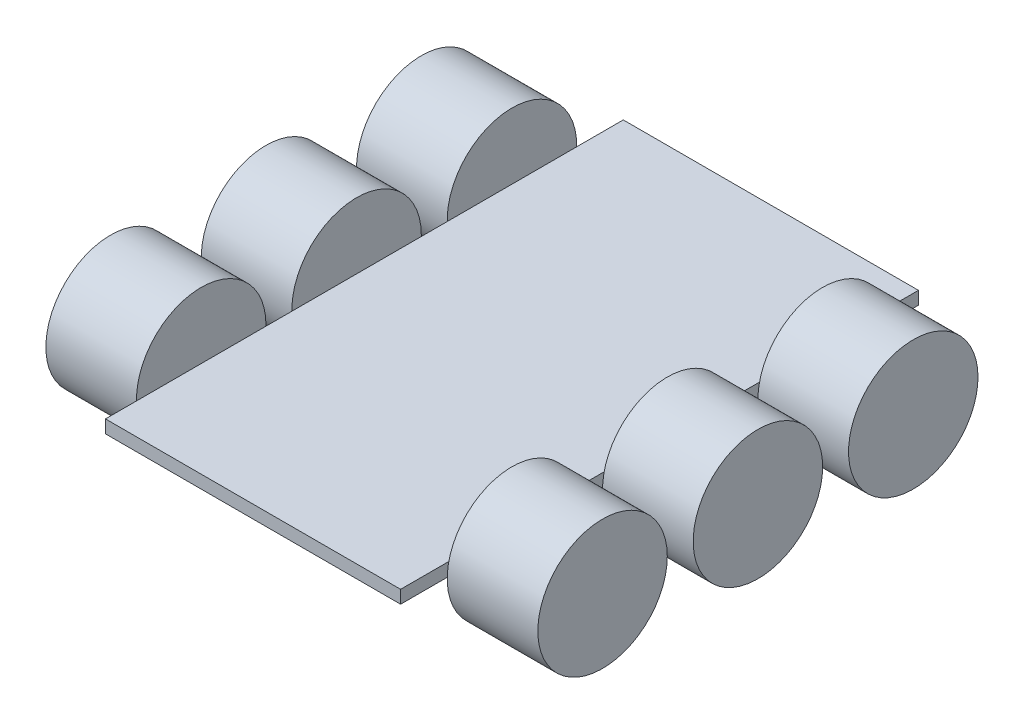
ISO-10303-21;
HEADER;
FILE_DESCRIPTION(('STEP AP214'),'2;1');
FILE_NAME('part.step','',(''),(''),'','','');
FILE_SCHEMA(('AUTOMOTIVE_DESIGN { 1 0 10303 214 1 1 1 1 }'));
ENDSEC;
DATA;
#1=APPLICATION_CONTEXT('core data for automotive mechanical design processes');
#2=APPLICATION_PROTOCOL_DEFINITION('international standard','automotive_design',2000,#1);
#3=PRODUCT_CONTEXT('',#1,'mechanical');
#4=PRODUCT('Part','Part','',(#3));
#5=PRODUCT_RELATED_PRODUCT_CATEGORY('part','',(#4));
#6=PRODUCT_DEFINITION_FORMATION('','',#4);
#7=PRODUCT_DEFINITION_CONTEXT('part definition',#1,'design');
#8=PRODUCT_DEFINITION('design','',#6,#7);
#9=PRODUCT_DEFINITION_SHAPE('','',#8);
#10=(LENGTH_UNIT() NAMED_UNIT(*) SI_UNIT(.MILLI.,.METRE.));
#11=(NAMED_UNIT(*) PLANE_ANGLE_UNIT() SI_UNIT($,.RADIAN.));
#12=(NAMED_UNIT(*) SI_UNIT($,.STERADIAN.) SOLID_ANGLE_UNIT());
#13=UNCERTAINTY_MEASURE_WITH_UNIT(LENGTH_MEASURE(1.E-05),#10,'distance_accuracy_value','');
#14=(GEOMETRIC_REPRESENTATION_CONTEXT(3) GLOBAL_UNCERTAINTY_ASSIGNED_CONTEXT((#13)) GLOBAL_UNIT_ASSIGNED_CONTEXT((#10,
#11,#12)) REPRESENTATION_CONTEXT('',''));
#15=CARTESIAN_POINT('',(0.,0.,0.));
#16=DIRECTION('',(0.,0.,1.));
#17=DIRECTION('',(1.,0.,0.));
#18=AXIS2_PLACEMENT_3D('',#15,#16,#17);
#19=CARTESIAN_POINT('',(-57.,2.5,-100.));
#20=DIRECTION('',(1.,0.,0.));
#21=DIRECTION('',(0.,0.,-1.));
#22=AXIS2_PLACEMENT_3D('',#19,#20,#21);
#23=PLANE('',#22);
#24=DIRECTION('',(0.,0.,1.));
#25=VECTOR('',#24,1.);
#26=CARTESIAN_POINT('',(-57.,-2.5,-100.));
#27=LINE('',#26,#25);
#28=CARTESIAN_POINT('',(-57.,-2.5,-100.));
#29=VERTEX_POINT('',#28);
#30=CARTESIAN_POINT('',(-57.,-2.5,100.));
#31=VERTEX_POINT('',#30);
#32=EDGE_CURVE('E130',#29,#31,#27,.T.);
#33=ORIENTED_EDGE('',*,*,#32,.T.);
#34=DIRECTION('',(0.,-1.,0.));
#35=VECTOR('',#34,1.);
#36=CARTESIAN_POINT('',(-57.,2.5,100.));
#37=LINE('',#36,#35);
#38=CARTESIAN_POINT('',(-57.,2.5,100.));
#39=VERTEX_POINT('',#38);
#40=EDGE_CURVE('E12',#39,#31,#37,.T.);
#41=ORIENTED_EDGE('',*,*,#40,.F.);
#42=DIRECTION('',(0.,0.,1.));
#43=VECTOR('',#42,1.);
#44=CARTESIAN_POINT('',(-57.,2.5,-100.));
#45=LINE('',#44,#43);
#46=CARTESIAN_POINT('',(-57.,2.5,-100.));
#47=VERTEX_POINT('',#46);
#48=EDGE_CURVE('E114',#47,#39,#45,.T.);
#49=ORIENTED_EDGE('',*,*,#48,.F.);
#50=DIRECTION('',(0.,-1.,0.));
#51=VECTOR('',#50,1.);
#52=CARTESIAN_POINT('',(-57.,2.5,-100.));
#53=LINE('',#52,#51);
#54=EDGE_CURVE('E126',#47,#29,#53,.T.);
#55=ORIENTED_EDGE('',*,*,#54,.T.);
#56=EDGE_LOOP('',(#33,#41,#49,#55));
#57=FACE_BOUND('',#56,.T.);
#58=ADVANCED_FACE('F62',(#57),#23,.F.);
#59=CARTESIAN_POINT('',(-57.,2.5,100.));
#60=DIRECTION('',(0.,0.,-1.));
#61=DIRECTION('',(-1.,0.,0.));
#62=AXIS2_PLACEMENT_3D('',#59,#60,#61);
#63=PLANE('',#62);
#64=DIRECTION('',(1.,0.,0.));
#65=VECTOR('',#64,1.);
#66=CARTESIAN_POINT('',(-57.,-2.5,100.));
#67=LINE('',#66,#65);
#68=CARTESIAN_POINT('',(57.,-2.5,100.));
#69=VERTEX_POINT('',#68);
#70=EDGE_CURVE('E119',#31,#69,#67,.T.);
#71=ORIENTED_EDGE('',*,*,#70,.T.);
#72=DIRECTION('',(0.,-1.,0.));
#73=VECTOR('',#72,1.);
#74=CARTESIAN_POINT('',(57.,2.5,100.));
#75=LINE('',#74,#73);
#76=CARTESIAN_POINT('',(57.,2.5,100.));
#77=VERTEX_POINT('',#76);
#78=EDGE_CURVE('E71',#77,#69,#75,.T.);
#79=ORIENTED_EDGE('',*,*,#78,.F.);
#80=DIRECTION('',(1.,0.,0.));
#81=VECTOR('',#80,1.);
#82=CARTESIAN_POINT('',(-57.,2.5,100.));
#83=LINE('',#82,#81);
#84=EDGE_CURVE('E109',#39,#77,#83,.T.);
#85=ORIENTED_EDGE('',*,*,#84,.F.);
#86=ORIENTED_EDGE('',*,*,#40,.T.);
#87=EDGE_LOOP('',(#71,#79,#85,#86));
#88=FACE_BOUND('',#87,.T.);
#89=ADVANCED_FACE('F118',(#88),#63,.F.);
#90=CARTESIAN_POINT('',(57.,2.5,-100.));
#91=DIRECTION('',(-1.,0.,0.));
#92=DIRECTION('',(0.,0.,1.));
#93=AXIS2_PLACEMENT_3D('',#90,#91,#92);
#94=PLANE('',#93);
#95=DIRECTION('',(0.,0.,-1.));
#96=VECTOR('',#95,1.);
#97=CARTESIAN_POINT('',(57.,-2.5,-100.));
#98=LINE('',#97,#96);
#99=CARTESIAN_POINT('',(57.,-2.5,-100.));
#100=VERTEX_POINT('',#99);
#101=EDGE_CURVE('E96',#69,#100,#98,.T.);
#102=ORIENTED_EDGE('',*,*,#101,.T.);
#103=DIRECTION('',(0.,-1.,0.));
#104=VECTOR('',#103,1.);
#105=CARTESIAN_POINT('',(57.,2.5,-100.));
#106=LINE('',#105,#104);
#107=CARTESIAN_POINT('',(57.,2.5,-100.));
#108=VERTEX_POINT('',#107);
#109=EDGE_CURVE('E121',#108,#100,#106,.T.);
#110=ORIENTED_EDGE('',*,*,#109,.F.);
#111=DIRECTION('',(0.,0.,-1.));
#112=VECTOR('',#111,1.);
#113=CARTESIAN_POINT('',(57.,2.5,-100.));
#114=LINE('',#113,#112);
#115=EDGE_CURVE('E112',#77,#108,#114,.T.);
#116=ORIENTED_EDGE('',*,*,#115,.F.);
#117=ORIENTED_EDGE('',*,*,#78,.T.);
#118=EDGE_LOOP('',(#102,#110,#116,#117));
#119=FACE_BOUND('',#118,.T.);
#120=ADVANCED_FACE('F122',(#119),#94,.F.);
#121=CARTESIAN_POINT('',(-57.,2.5,-100.));
#122=DIRECTION('',(0.,0.,1.));
#123=DIRECTION('',(1.,0.,0.));
#124=AXIS2_PLACEMENT_3D('',#121,#122,#123);
#125=PLANE('',#124);
#126=DIRECTION('',(-1.,0.,0.));
#127=VECTOR('',#126,1.);
#128=CARTESIAN_POINT('',(-57.,-2.5,-100.));
#129=LINE('',#128,#127);
#130=EDGE_CURVE('E102',#100,#29,#129,.T.);
#131=ORIENTED_EDGE('',*,*,#130,.T.);
#132=ORIENTED_EDGE('',*,*,#54,.F.);
#133=DIRECTION('',(-1.,0.,0.));
#134=VECTOR('',#133,1.);
#135=CARTESIAN_POINT('',(-57.,2.5,-100.));
#136=LINE('',#135,#134);
#137=EDGE_CURVE('E79',#108,#47,#136,.T.);
#138=ORIENTED_EDGE('',*,*,#137,.F.);
#139=ORIENTED_EDGE('',*,*,#109,.T.);
#140=EDGE_LOOP('',(#131,#132,#138,#139));
#141=FACE_BOUND('',#140,.T.);
#142=ADVANCED_FACE('F143',(#141),#125,.F.);
#143=CARTESIAN_POINT('',(0.,2.5,0.));
#144=DIRECTION('',(0.,1.,0.));
#145=DIRECTION('',(0.,0.,1.));
#146=AXIS2_PLACEMENT_3D('',#143,#144,#145);
#147=PLANE('',#146);
#148=ORIENTED_EDGE('',*,*,#48,.T.);
#149=ORIENTED_EDGE('',*,*,#84,.T.);
#150=ORIENTED_EDGE('',*,*,#115,.T.);
#151=ORIENTED_EDGE('',*,*,#137,.T.);
#152=EDGE_LOOP('',(#148,#149,#150,#151));
#153=FACE_BOUND('',#152,.T.);
#154=ADVANCED_FACE('F110',(#153),#147,.T.);
#155=CARTESIAN_POINT('',(0.,-2.5,0.));
#156=DIRECTION('',(0.,1.,0.));
#157=DIRECTION('',(0.,0.,1.));
#158=AXIS2_PLACEMENT_3D('',#155,#156,#157);
#159=PLANE('',#158);
#160=ORIENTED_EDGE('',*,*,#32,.F.);
#161=ORIENTED_EDGE('',*,*,#130,.F.);
#162=ORIENTED_EDGE('',*,*,#101,.F.);
#163=ORIENTED_EDGE('',*,*,#70,.F.);
#164=EDGE_LOOP('',(#160,#161,#162,#163));
#165=FACE_BOUND('',#164,.T.);
#166=ADVANCED_FACE('F146',(#165),#159,.F.);
#167=CLOSED_SHELL('',(#58,#89,#120,#142,#154,#166));
#168=MANIFOLD_SOLID_BREP('B2',#167);
#169=CARTESIAN_POINT('',(95.,0.,0.));
#170=DIRECTION('',(-1.,0.,0.));
#171=DIRECTION('',(0.,0.,1.));
#172=AXIS2_PLACEMENT_3D('',#169,#170,#171);
#173=CYLINDRICAL_SURFACE('',#172,25.);
#174=CARTESIAN_POINT('',(-95.,0.,0.));
#175=DIRECTION('',(1.,0.,0.));
#176=DIRECTION('',(0.,0.,-1.));
#177=AXIS2_PLACEMENT_3D('',#174,#175,#176);
#178=CIRCLE('',#177,25.);
#179=CARTESIAN_POINT('',(-95.,0.,-25.));
#180=VERTEX_POINT('',#179);
#181=EDGE_CURVE('E212',#180,#180,#178,.T.);
#182=ORIENTED_EDGE('',*,*,#181,.T.);
#183=EDGE_LOOP('',(#182));
#184=FACE_BOUND('',#183,.T.);
#185=CARTESIAN_POINT('',(-60.,0.,0.));
#186=DIRECTION('',(1.,0.,0.));
#187=DIRECTION('',(0.,0.,-1.));
#188=AXIS2_PLACEMENT_3D('',#185,#186,#187);
#189=CIRCLE('',#188,25.);
#190=CARTESIAN_POINT('',(-60.,0.,-25.));
#191=VERTEX_POINT('',#190);
#192=EDGE_CURVE('E61',#191,#191,#189,.T.);
#193=ORIENTED_EDGE('',*,*,#192,.F.);
#194=EDGE_LOOP('',(#193));
#195=FACE_BOUND('',#194,.T.);
#196=ADVANCED_FACE('F206',(#184,#195),#173,.T.);
#197=CARTESIAN_POINT('',(-95.,0.,0.));
#198=DIRECTION('',(1.,0.,0.));
#199=DIRECTION('',(0.,0.,-1.));
#200=AXIS2_PLACEMENT_3D('',#197,#198,#199);
#201=PLANE('',#200);
#202=ORIENTED_EDGE('',*,*,#181,.F.);
#203=EDGE_LOOP('',(#202));
#204=FACE_BOUND('',#203,.T.);
#205=ADVANCED_FACE('F220',(#204),#201,.F.);
#206=CARTESIAN_POINT('',(-60.,0.,0.));
#207=DIRECTION('',(1.,0.,0.));
#208=DIRECTION('',(0.,0.,-1.));
#209=AXIS2_PLACEMENT_3D('',#206,#207,#208);
#210=PLANE('',#209);
#211=ORIENTED_EDGE('',*,*,#192,.T.);
#212=EDGE_LOOP('',(#211));
#213=FACE_BOUND('',#212,.T.);
#214=ADVANCED_FACE('F222',(#213),#210,.T.);
#215=CLOSED_SHELL('',(#196,#205,#214));
#216=MANIFOLD_SOLID_BREP('B6',#215);
#217=CARTESIAN_POINT('',(95.,0.,60.));
#218=DIRECTION('',(-1.,0.,0.));
#219=DIRECTION('',(0.,0.,1.));
#220=AXIS2_PLACEMENT_3D('',#217,#218,#219);
#221=CYLINDRICAL_SURFACE('',#220,25.);
#222=CARTESIAN_POINT('',(-95.,0.,60.));
#223=DIRECTION('',(1.,0.,0.));
#224=DIRECTION('',(0.,0.,-1.));
#225=AXIS2_PLACEMENT_3D('',#222,#223,#224);
#226=CIRCLE('',#225,25.);
#227=CARTESIAN_POINT('',(-95.,0.,35.));
#228=VERTEX_POINT('',#227);
#229=EDGE_CURVE('E291',#228,#228,#226,.T.);
#230=ORIENTED_EDGE('',*,*,#229,.T.);
#231=EDGE_LOOP('',(#230));
#232=FACE_BOUND('',#231,.T.);
#233=CARTESIAN_POINT('',(-60.,0.,60.));
#234=DIRECTION('',(1.,0.,0.));
#235=DIRECTION('',(0.,0.,-1.));
#236=AXIS2_PLACEMENT_3D('',#233,#234,#235);
#237=CIRCLE('',#236,25.);
#238=CARTESIAN_POINT('',(-60.,0.,35.));
#239=VERTEX_POINT('',#238);
#240=EDGE_CURVE('E205',#239,#239,#237,.T.);
#241=ORIENTED_EDGE('',*,*,#240,.F.);
#242=EDGE_LOOP('',(#241));
#243=FACE_BOUND('',#242,.T.);
#244=ADVANCED_FACE('F285',(#232,#243),#221,.T.);
#245=CARTESIAN_POINT('',(-95.,0.,0.));
#246=DIRECTION('',(1.,0.,0.));
#247=DIRECTION('',(0.,0.,-1.));
#248=AXIS2_PLACEMENT_3D('',#245,#246,#247);
#249=PLANE('',#248);
#250=ORIENTED_EDGE('',*,*,#229,.F.);
#251=EDGE_LOOP('',(#250));
#252=FACE_BOUND('',#251,.T.);
#253=ADVANCED_FACE('F299',(#252),#249,.F.);
#254=CARTESIAN_POINT('',(-60.,0.,0.));
#255=DIRECTION('',(1.,0.,0.));
#256=DIRECTION('',(0.,0.,-1.));
#257=AXIS2_PLACEMENT_3D('',#254,#255,#256);
#258=PLANE('',#257);
#259=ORIENTED_EDGE('',*,*,#240,.T.);
#260=EDGE_LOOP('',(#259));
#261=FACE_BOUND('',#260,.T.);
#262=ADVANCED_FACE('F301',(#261),#258,.T.);
#263=CLOSED_SHELL('',(#244,#253,#262));
#264=MANIFOLD_SOLID_BREP('B56',#263);
#265=CARTESIAN_POINT('',(95.,0.,-60.));
#266=DIRECTION('',(-1.,0.,0.));
#267=DIRECTION('',(0.,0.,1.));
#268=AXIS2_PLACEMENT_3D('',#265,#266,#267);
#269=CYLINDRICAL_SURFACE('',#268,25.);
#270=CARTESIAN_POINT('',(-95.,0.,-60.));
#271=DIRECTION('',(1.,0.,0.));
#272=DIRECTION('',(0.,0.,-1.));
#273=AXIS2_PLACEMENT_3D('',#270,#271,#272);
#274=CIRCLE('',#273,25.);
#275=CARTESIAN_POINT('',(-95.,0.,-85.));
#276=VERTEX_POINT('',#275);
#277=EDGE_CURVE('E373',#276,#276,#274,.T.);
#278=ORIENTED_EDGE('',*,*,#277,.T.);
#279=EDGE_LOOP('',(#278));
#280=FACE_BOUND('',#279,.T.);
#281=CARTESIAN_POINT('',(-60.,0.,-60.));
#282=DIRECTION('',(1.,0.,0.));
#283=DIRECTION('',(0.,0.,-1.));
#284=AXIS2_PLACEMENT_3D('',#281,#282,#283);
#285=CIRCLE('',#284,25.);
#286=CARTESIAN_POINT('',(-60.,0.,-85.));
#287=VERTEX_POINT('',#286);
#288=EDGE_CURVE('E284',#287,#287,#285,.T.);
#289=ORIENTED_EDGE('',*,*,#288,.F.);
#290=EDGE_LOOP('',(#289));
#291=FACE_BOUND('',#290,.T.);
#292=ADVANCED_FACE('F367',(#280,#291),#269,.T.);
#293=CARTESIAN_POINT('',(-95.,0.,0.));
#294=DIRECTION('',(1.,0.,0.));
#295=DIRECTION('',(0.,0.,-1.));
#296=AXIS2_PLACEMENT_3D('',#293,#294,#295);
#297=PLANE('',#296);
#298=ORIENTED_EDGE('',*,*,#277,.F.);
#299=EDGE_LOOP('',(#298));
#300=FACE_BOUND('',#299,.T.);
#301=ADVANCED_FACE('F381',(#300),#297,.F.);
#302=CARTESIAN_POINT('',(-60.,0.,0.));
#303=DIRECTION('',(1.,0.,0.));
#304=DIRECTION('',(0.,0.,-1.));
#305=AXIS2_PLACEMENT_3D('',#302,#303,#304);
#306=PLANE('',#305);
#307=ORIENTED_EDGE('',*,*,#288,.T.);
#308=EDGE_LOOP('',(#307));
#309=FACE_BOUND('',#308,.T.);
#310=ADVANCED_FACE('F383',(#309),#306,.T.);
#311=CLOSED_SHELL('',(#292,#301,#310));
#312=MANIFOLD_SOLID_BREP('B200',#311);
#313=CARTESIAN_POINT('',(95.,0.,0.));
#314=DIRECTION('',(1.,0.,0.));
#315=DIRECTION('',(0.,0.,-1.));
#316=AXIS2_PLACEMENT_3D('',#313,#314,#315);
#317=PLANE('',#316);
#318=CARTESIAN_POINT('',(95.,0.,0.));
#319=DIRECTION('',(1.,0.,0.));
#320=DIRECTION('',(0.,0.,-1.));
#321=AXIS2_PLACEMENT_3D('',#318,#319,#320);
#322=CIRCLE('',#321,25.);
#323=CARTESIAN_POINT('',(95.,0.,-25.));
#324=VERTEX_POINT('',#323);
#325=EDGE_CURVE('E366',#324,#324,#322,.T.);
#326=ORIENTED_EDGE('',*,*,#325,.T.);
#327=EDGE_LOOP('',(#326));
#328=FACE_BOUND('',#327,.T.);
#329=ADVANCED_FACE('F449',(#328),#317,.T.);
#330=CARTESIAN_POINT('',(95.,0.,0.));
#331=DIRECTION('',(-1.,0.,0.));
#332=DIRECTION('',(0.,0.,1.));
#333=AXIS2_PLACEMENT_3D('',#330,#331,#332);
#334=CYLINDRICAL_SURFACE('',#333,25.);
#335=CARTESIAN_POINT('',(60.,0.,0.));
#336=DIRECTION('',(1.,0.,0.));
#337=DIRECTION('',(0.,0.,-1.));
#338=AXIS2_PLACEMENT_3D('',#335,#336,#337);
#339=CIRCLE('',#338,25.);
#340=CARTESIAN_POINT('',(60.,0.,-25.));
#341=VERTEX_POINT('',#340);
#342=EDGE_CURVE('E456',#341,#341,#339,.T.);
#343=ORIENTED_EDGE('',*,*,#342,.T.);
#344=EDGE_LOOP('',(#343));
#345=FACE_BOUND('',#344,.T.);
#346=ORIENTED_EDGE('',*,*,#325,.F.);
#347=EDGE_LOOP('',(#346));
#348=FACE_BOUND('',#347,.T.);
#349=ADVANCED_FACE('F451',(#345,#348),#334,.T.);
#350=CARTESIAN_POINT('',(60.,0.,0.));
#351=DIRECTION('',(1.,0.,0.));
#352=DIRECTION('',(0.,0.,-1.));
#353=AXIS2_PLACEMENT_3D('',#350,#351,#352);
#354=PLANE('',#353);
#355=ORIENTED_EDGE('',*,*,#342,.F.);
#356=EDGE_LOOP('',(#355));
#357=FACE_BOUND('',#356,.T.);
#358=ADVANCED_FACE('F464',(#357),#354,.F.);
#359=CLOSED_SHELL('',(#329,#349,#358));
#360=MANIFOLD_SOLID_BREP('B279',#359);
#361=CARTESIAN_POINT('',(95.,0.,0.));
#362=DIRECTION('',(1.,0.,0.));
#363=DIRECTION('',(0.,0.,-1.));
#364=AXIS2_PLACEMENT_3D('',#361,#362,#363);
#365=PLANE('',#364);
#366=CARTESIAN_POINT('',(95.,0.,60.));
#367=DIRECTION('',(1.,0.,0.));
#368=DIRECTION('',(0.,0.,-1.));
#369=AXIS2_PLACEMENT_3D('',#366,#367,#368);
#370=CIRCLE('',#369,25.);
#371=CARTESIAN_POINT('',(95.,0.,35.));
#372=VERTEX_POINT('',#371);
#373=EDGE_CURVE('E448',#372,#372,#370,.T.);
#374=ORIENTED_EDGE('',*,*,#373,.T.);
#375=EDGE_LOOP('',(#374));
#376=FACE_BOUND('',#375,.T.);
#377=ADVANCED_FACE('F527',(#376),#365,.T.);
#378=CARTESIAN_POINT('',(95.,0.,60.));
#379=DIRECTION('',(-1.,0.,0.));
#380=DIRECTION('',(0.,0.,1.));
#381=AXIS2_PLACEMENT_3D('',#378,#379,#380);
#382=CYLINDRICAL_SURFACE('',#381,25.);
#383=CARTESIAN_POINT('',(60.,0.,60.));
#384=DIRECTION('',(1.,0.,0.));
#385=DIRECTION('',(0.,0.,-1.));
#386=AXIS2_PLACEMENT_3D('',#383,#384,#385);
#387=CIRCLE('',#386,25.);
#388=CARTESIAN_POINT('',(60.,0.,35.));
#389=VERTEX_POINT('',#388);
#390=EDGE_CURVE('E534',#389,#389,#387,.T.);
#391=ORIENTED_EDGE('',*,*,#390,.T.);
#392=EDGE_LOOP('',(#391));
#393=FACE_BOUND('',#392,.T.);
#394=ORIENTED_EDGE('',*,*,#373,.F.);
#395=EDGE_LOOP('',(#394));
#396=FACE_BOUND('',#395,.T.);
#397=ADVANCED_FACE('F529',(#393,#396),#382,.T.);
#398=CARTESIAN_POINT('',(60.,0.,0.));
#399=DIRECTION('',(1.,0.,0.));
#400=DIRECTION('',(0.,0.,-1.));
#401=AXIS2_PLACEMENT_3D('',#398,#399,#400);
#402=PLANE('',#401);
#403=ORIENTED_EDGE('',*,*,#390,.F.);
#404=EDGE_LOOP('',(#403));
#405=FACE_BOUND('',#404,.T.);
#406=ADVANCED_FACE('F542',(#405),#402,.F.);
#407=CLOSED_SHELL('',(#377,#397,#406));
#408=MANIFOLD_SOLID_BREP('B361',#407);
#409=CARTESIAN_POINT('',(95.,0.,0.));
#410=DIRECTION('',(1.,0.,0.));
#411=DIRECTION('',(0.,0.,-1.));
#412=AXIS2_PLACEMENT_3D('',#409,#410,#411);
#413=PLANE('',#412);
#414=CARTESIAN_POINT('',(95.,0.,-60.));
#415=DIRECTION('',(1.,0.,0.));
#416=DIRECTION('',(0.,0.,-1.));
#417=AXIS2_PLACEMENT_3D('',#414,#415,#416);
#418=CIRCLE('',#417,25.);
#419=CARTESIAN_POINT('',(95.,0.,-85.));
#420=VERTEX_POINT('',#419);
#421=EDGE_CURVE('E526',#420,#420,#418,.T.);
#422=ORIENTED_EDGE('',*,*,#421,.T.);
#423=EDGE_LOOP('',(#422));
#424=FACE_BOUND('',#423,.T.);
#425=ADVANCED_FACE('F601',(#424),#413,.T.);
#426=CARTESIAN_POINT('',(95.,0.,-60.));
#427=DIRECTION('',(-1.,0.,0.));
#428=DIRECTION('',(0.,0.,1.));
#429=AXIS2_PLACEMENT_3D('',#426,#427,#428);
#430=CYLINDRICAL_SURFACE('',#429,25.);
#431=CARTESIAN_POINT('',(60.,0.,-60.));
#432=DIRECTION('',(1.,0.,0.));
#433=DIRECTION('',(0.,0.,-1.));
#434=AXIS2_PLACEMENT_3D('',#431,#432,#433);
#435=CIRCLE('',#434,25.);
#436=CARTESIAN_POINT('',(60.,0.,-85.));
#437=VERTEX_POINT('',#436);
#438=EDGE_CURVE('E608',#437,#437,#435,.T.);
#439=ORIENTED_EDGE('',*,*,#438,.T.);
#440=EDGE_LOOP('',(#439));
#441=FACE_BOUND('',#440,.T.);
#442=ORIENTED_EDGE('',*,*,#421,.F.);
#443=EDGE_LOOP('',(#442));
#444=FACE_BOUND('',#443,.T.);
#445=ADVANCED_FACE('F603',(#441,#444),#430,.T.);
#446=CARTESIAN_POINT('',(60.,0.,0.));
#447=DIRECTION('',(1.,0.,0.));
#448=DIRECTION('',(0.,0.,-1.));
#449=AXIS2_PLACEMENT_3D('',#446,#447,#448);
#450=PLANE('',#449);
#451=ORIENTED_EDGE('',*,*,#438,.F.);
#452=EDGE_LOOP('',(#451));
#453=FACE_BOUND('',#452,.T.);
#454=ADVANCED_FACE('F616',(#453),#450,.F.);
#455=CLOSED_SHELL('',(#425,#445,#454));
#456=MANIFOLD_SOLID_BREP('B443',#455);
#457=ADVANCED_BREP_SHAPE_REPRESENTATION('',(#18,#168,#216,#264,#312,#360,#408,#456),#14);
#458=SHAPE_DEFINITION_REPRESENTATION(#9,#457);
ENDSEC;
END-ISO-10303-21;
